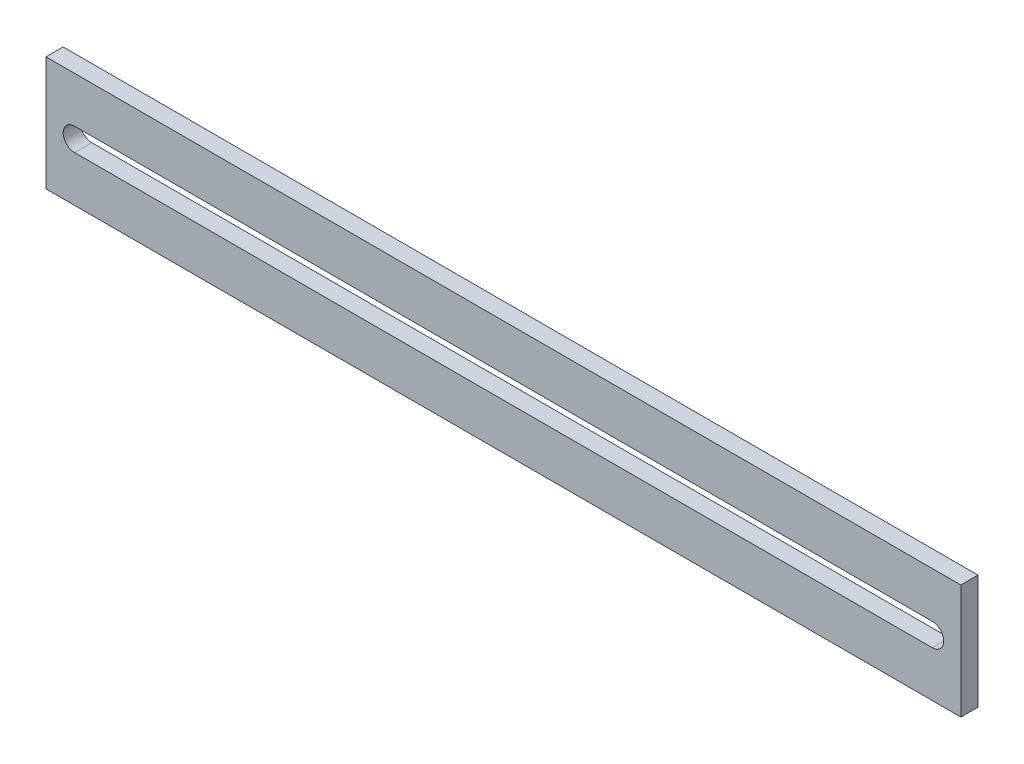
ISO-10303-21;
HEADER;
FILE_DESCRIPTION(('STEP AP214'),'2;1');
FILE_NAME('part.step','',(''),(''),'','','');
FILE_SCHEMA(('AUTOMOTIVE_DESIGN { 1 0 10303 214 1 1 1 1 }'));
ENDSEC;
DATA;
#1=APPLICATION_CONTEXT('core data for automotive mechanical design processes');
#2=APPLICATION_PROTOCOL_DEFINITION('international standard','automotive_design',2000,#1);
#3=PRODUCT_CONTEXT('',#1,'mechanical');
#4=PRODUCT('Part','Part','',(#3));
#5=PRODUCT_RELATED_PRODUCT_CATEGORY('part','',(#4));
#6=PRODUCT_DEFINITION_FORMATION('','',#4);
#7=PRODUCT_DEFINITION_CONTEXT('part definition',#1,'design');
#8=PRODUCT_DEFINITION('design','',#6,#7);
#9=PRODUCT_DEFINITION_SHAPE('','',#8);
#10=(LENGTH_UNIT() NAMED_UNIT(*) SI_UNIT(.MILLI.,.METRE.));
#11=(NAMED_UNIT(*) PLANE_ANGLE_UNIT() SI_UNIT($,.RADIAN.));
#12=(NAMED_UNIT(*) SI_UNIT($,.STERADIAN.) SOLID_ANGLE_UNIT());
#13=UNCERTAINTY_MEASURE_WITH_UNIT(LENGTH_MEASURE(1.E-05),#10,'distance_accuracy_value','');
#14=(GEOMETRIC_REPRESENTATION_CONTEXT(3) GLOBAL_UNCERTAINTY_ASSIGNED_CONTEXT((#13)) GLOBAL_UNIT_ASSIGNED_CONTEXT((#10,
#11,#12)) REPRESENTATION_CONTEXT('',''));
#15=CARTESIAN_POINT('',(0.,0.,0.));
#16=DIRECTION('',(0.,0.,1.));
#17=DIRECTION('',(1.,0.,0.));
#18=AXIS2_PLACEMENT_3D('',#15,#16,#17);
#19=CARTESIAN_POINT('',(80.,10.,3.));
#20=DIRECTION('',(-1.,0.,0.));
#21=DIRECTION('',(0.,0.,1.));
#22=AXIS2_PLACEMENT_3D('',#19,#20,#21);
#23=PLANE('',#22);
#24=DIRECTION('',(0.,1.,0.));
#25=VECTOR('',#24,1.);
#26=CARTESIAN_POINT('',(80.,10.,0.));
#27=LINE('',#26,#25);
#28=CARTESIAN_POINT('',(80.,-10.,0.));
#29=VERTEX_POINT('',#28);
#30=CARTESIAN_POINT('',(80.,10.,0.));
#31=VERTEX_POINT('',#30);
#32=EDGE_CURVE('E131',#29,#31,#27,.T.);
#33=ORIENTED_EDGE('',*,*,#32,.T.);
#34=DIRECTION('',(0.,0.,-1.));
#35=VECTOR('',#34,1.);
#36=CARTESIAN_POINT('',(80.,10.,3.));
#37=LINE('',#36,#35);
#38=CARTESIAN_POINT('',(80.,10.,3.));
#39=VERTEX_POINT('',#38);
#40=EDGE_CURVE('E11',#39,#31,#37,.T.);
#41=ORIENTED_EDGE('',*,*,#40,.F.);
#42=DIRECTION('',(0.,1.,0.));
#43=VECTOR('',#42,1.);
#44=CARTESIAN_POINT('',(80.,10.,3.));
#45=LINE('',#44,#43);
#46=CARTESIAN_POINT('',(80.,-10.,3.));
#47=VERTEX_POINT('',#46);
#48=EDGE_CURVE('E135',#47,#39,#45,.T.);
#49=ORIENTED_EDGE('',*,*,#48,.F.);
#50=DIRECTION('',(0.,0.,-1.));
#51=VECTOR('',#50,1.);
#52=CARTESIAN_POINT('',(80.,-10.,3.));
#53=LINE('',#52,#51);
#54=EDGE_CURVE('E145',#47,#29,#53,.T.);
#55=ORIENTED_EDGE('',*,*,#54,.T.);
#56=EDGE_LOOP('',(#33,#41,#49,#55));
#57=FACE_BOUND('',#56,.T.);
#58=ADVANCED_FACE('F34',(#57),#23,.F.);
#59=CARTESIAN_POINT('',(-80.,10.,3.));
#60=DIRECTION('',(0.,-1.,0.));
#61=DIRECTION('',(0.,0.,-1.));
#62=AXIS2_PLACEMENT_3D('',#59,#60,#61);
#63=PLANE('',#62);
#64=DIRECTION('',(-1.,0.,0.));
#65=VECTOR('',#64,1.);
#66=CARTESIAN_POINT('',(-80.,10.,0.));
#67=LINE('',#66,#65);
#68=CARTESIAN_POINT('',(-80.,10.,0.));
#69=VERTEX_POINT('',#68);
#70=EDGE_CURVE('E148',#31,#69,#67,.T.);
#71=ORIENTED_EDGE('',*,*,#70,.T.);
#72=DIRECTION('',(0.,0.,-1.));
#73=VECTOR('',#72,1.);
#74=CARTESIAN_POINT('',(-80.,10.,3.));
#75=LINE('',#74,#73);
#76=CARTESIAN_POINT('',(-80.,10.,3.));
#77=VERTEX_POINT('',#76);
#78=EDGE_CURVE('E41',#77,#69,#75,.T.);
#79=ORIENTED_EDGE('',*,*,#78,.F.);
#80=DIRECTION('',(-1.,0.,0.));
#81=VECTOR('',#80,1.);
#82=CARTESIAN_POINT('',(-80.,10.,3.));
#83=LINE('',#82,#81);
#84=EDGE_CURVE('E138',#39,#77,#83,.T.);
#85=ORIENTED_EDGE('',*,*,#84,.F.);
#86=ORIENTED_EDGE('',*,*,#40,.T.);
#87=EDGE_LOOP('',(#71,#79,#85,#86));
#88=FACE_BOUND('',#87,.T.);
#89=ADVANCED_FACE('F176',(#88),#63,.F.);
#90=CARTESIAN_POINT('',(-80.,10.,3.));
#91=DIRECTION('',(1.,0.,0.));
#92=DIRECTION('',(0.,0.,-1.));
#93=AXIS2_PLACEMENT_3D('',#90,#91,#92);
#94=PLANE('',#93);
#95=DIRECTION('',(0.,-1.,0.));
#96=VECTOR('',#95,1.);
#97=CARTESIAN_POINT('',(-80.,10.,0.));
#98=LINE('',#97,#96);
#99=CARTESIAN_POINT('',(-80.,-10.,0.));
#100=VERTEX_POINT('',#99);
#101=EDGE_CURVE('E150',#69,#100,#98,.T.);
#102=ORIENTED_EDGE('',*,*,#101,.T.);
#103=DIRECTION('',(0.,0.,-1.));
#104=VECTOR('',#103,1.);
#105=CARTESIAN_POINT('',(-80.,-10.,3.));
#106=LINE('',#105,#104);
#107=CARTESIAN_POINT('',(-80.,-10.,3.));
#108=VERTEX_POINT('',#107);
#109=EDGE_CURVE('E155',#108,#100,#106,.T.);
#110=ORIENTED_EDGE('',*,*,#109,.F.);
#111=DIRECTION('',(0.,-1.,0.));
#112=VECTOR('',#111,1.);
#113=CARTESIAN_POINT('',(-80.,10.,3.));
#114=LINE('',#113,#112);
#115=EDGE_CURVE('E141',#77,#108,#114,.T.);
#116=ORIENTED_EDGE('',*,*,#115,.F.);
#117=ORIENTED_EDGE('',*,*,#78,.T.);
#118=EDGE_LOOP('',(#102,#110,#116,#117));
#119=FACE_BOUND('',#118,.T.);
#120=ADVANCED_FACE('F162',(#119),#94,.F.);
#121=CARTESIAN_POINT('',(-80.,-10.,3.));
#122=DIRECTION('',(0.,1.,0.));
#123=DIRECTION('',(0.,0.,1.));
#124=AXIS2_PLACEMENT_3D('',#121,#122,#123);
#125=PLANE('',#124);
#126=DIRECTION('',(1.,0.,0.));
#127=VECTOR('',#126,1.);
#128=CARTESIAN_POINT('',(-80.,-10.,0.));
#129=LINE('',#128,#127);
#130=EDGE_CURVE('E139',#100,#29,#129,.T.);
#131=ORIENTED_EDGE('',*,*,#130,.T.);
#132=ORIENTED_EDGE('',*,*,#54,.F.);
#133=DIRECTION('',(1.,0.,0.));
#134=VECTOR('',#133,1.);
#135=CARTESIAN_POINT('',(-80.,-10.,3.));
#136=LINE('',#135,#134);
#137=EDGE_CURVE('E143',#108,#47,#136,.T.);
#138=ORIENTED_EDGE('',*,*,#137,.F.);
#139=ORIENTED_EDGE('',*,*,#109,.T.);
#140=EDGE_LOOP('',(#131,#132,#138,#139));
#141=FACE_BOUND('',#140,.T.);
#142=ADVANCED_FACE('F169',(#141),#125,.F.);
#143=CARTESIAN_POINT('',(0.,0.,3.));
#144=DIRECTION('',(0.,0.,1.));
#145=DIRECTION('',(1.,0.,0.));
#146=AXIS2_PLACEMENT_3D('',#143,#144,#145);
#147=PLANE('',#146);
#148=CARTESIAN_POINT('',(-75.,0.,3.));
#149=DIRECTION('',(0.,0.,1.));
#150=DIRECTION('',(1.,0.,0.));
#151=AXIS2_PLACEMENT_3D('',#148,#149,#150);
#152=CIRCLE('',#151,2.);
#153=CARTESIAN_POINT('',(-75.,2.,3.));
#154=VERTEX_POINT('',#153);
#155=CARTESIAN_POINT('',(-75.,-2.,3.));
#156=VERTEX_POINT('',#155);
#157=EDGE_CURVE('E48',#154,#156,#152,.T.);
#158=ORIENTED_EDGE('',*,*,#157,.F.);
#159=DIRECTION('',(-1.,0.,0.));
#160=VECTOR('',#159,1.);
#161=CARTESIAN_POINT('',(-75.,2.,3.));
#162=LINE('',#161,#160);
#163=CARTESIAN_POINT('',(75.,2.,3.));
#164=VERTEX_POINT('',#163);
#165=EDGE_CURVE('E116',#164,#154,#162,.T.);
#166=ORIENTED_EDGE('',*,*,#165,.F.);
#167=CARTESIAN_POINT('',(75.,0.,3.));
#168=DIRECTION('',(0.,0.,1.));
#169=DIRECTION('',(1.,0.,0.));
#170=AXIS2_PLACEMENT_3D('',#167,#168,#169);
#171=CIRCLE('',#170,2.);
#172=CARTESIAN_POINT('',(75.,-2.,3.));
#173=VERTEX_POINT('',#172);
#174=EDGE_CURVE('E119',#173,#164,#171,.T.);
#175=ORIENTED_EDGE('',*,*,#174,.F.);
#176=DIRECTION('',(1.,0.,0.));
#177=VECTOR('',#176,1.);
#178=CARTESIAN_POINT('',(-75.,-2.,3.));
#179=LINE('',#178,#177);
#180=EDGE_CURVE('E125',#156,#173,#179,.T.);
#181=ORIENTED_EDGE('',*,*,#180,.F.);
#182=EDGE_LOOP('',(#158,#166,#175,#181));
#183=FACE_BOUND('',#182,.T.);
#184=ORIENTED_EDGE('',*,*,#48,.T.);
#185=ORIENTED_EDGE('',*,*,#84,.T.);
#186=ORIENTED_EDGE('',*,*,#115,.T.);
#187=ORIENTED_EDGE('',*,*,#137,.T.);
#188=EDGE_LOOP('',(#184,#185,#186,#187));
#189=FACE_BOUND('',#188,.T.);
#190=ADVANCED_FACE('F175',(#183,#189),#147,.T.);
#191=CARTESIAN_POINT('',(0.,0.,0.));
#192=DIRECTION('',(0.,0.,1.));
#193=DIRECTION('',(1.,0.,0.));
#194=AXIS2_PLACEMENT_3D('',#191,#192,#193);
#195=PLANE('',#194);
#196=DIRECTION('',(-1.,0.,0.));
#197=VECTOR('',#196,1.);
#198=CARTESIAN_POINT('',(-75.,2.,0.));
#199=LINE('',#198,#197);
#200=CARTESIAN_POINT('',(75.,2.,0.));
#201=VERTEX_POINT('',#200);
#202=CARTESIAN_POINT('',(-75.,2.,0.));
#203=VERTEX_POINT('',#202);
#204=EDGE_CURVE('E106',#201,#203,#199,.T.);
#205=ORIENTED_EDGE('',*,*,#204,.T.);
#206=CARTESIAN_POINT('',(-75.,0.,0.));
#207=DIRECTION('',(0.,0.,1.));
#208=DIRECTION('',(1.,0.,0.));
#209=AXIS2_PLACEMENT_3D('',#206,#207,#208);
#210=CIRCLE('',#209,2.);
#211=CARTESIAN_POINT('',(-75.,-2.,0.));
#212=VERTEX_POINT('',#211);
#213=EDGE_CURVE('E100',#203,#212,#210,.T.);
#214=ORIENTED_EDGE('',*,*,#213,.T.);
#215=DIRECTION('',(1.,0.,0.));
#216=VECTOR('',#215,1.);
#217=CARTESIAN_POINT('',(-75.,-2.,0.));
#218=LINE('',#217,#216);
#219=CARTESIAN_POINT('',(75.,-2.,0.));
#220=VERTEX_POINT('',#219);
#221=EDGE_CURVE('E109',#212,#220,#218,.T.);
#222=ORIENTED_EDGE('',*,*,#221,.T.);
#223=CARTESIAN_POINT('',(75.,0.,0.));
#224=DIRECTION('',(0.,0.,1.));
#225=DIRECTION('',(1.,0.,0.));
#226=AXIS2_PLACEMENT_3D('',#223,#224,#225);
#227=CIRCLE('',#226,2.);
#228=EDGE_CURVE('E56',#220,#201,#227,.T.);
#229=ORIENTED_EDGE('',*,*,#228,.T.);
#230=EDGE_LOOP('',(#205,#214,#222,#229));
#231=FACE_BOUND('',#230,.T.);
#232=ORIENTED_EDGE('',*,*,#32,.F.);
#233=ORIENTED_EDGE('',*,*,#130,.F.);
#234=ORIENTED_EDGE('',*,*,#101,.F.);
#235=ORIENTED_EDGE('',*,*,#70,.F.);
#236=EDGE_LOOP('',(#232,#233,#234,#235));
#237=FACE_BOUND('',#236,.T.);
#238=ADVANCED_FACE('F113',(#231,#237),#195,.F.);
#239=CARTESIAN_POINT('',(-75.,0.,0.));
#240=DIRECTION('',(0.,0.,1.));
#241=DIRECTION('',(1.,0.,0.));
#242=AXIS2_PLACEMENT_3D('',#239,#240,#241);
#243=CYLINDRICAL_SURFACE('',#242,2.);
#244=ORIENTED_EDGE('',*,*,#157,.T.);
#245=DIRECTION('',(0.,0.,1.));
#246=VECTOR('',#245,1.);
#247=CARTESIAN_POINT('',(-75.,-2.,0.));
#248=LINE('',#247,#246);
#249=EDGE_CURVE('E96',#212,#156,#248,.T.);
#250=ORIENTED_EDGE('',*,*,#249,.F.);
#251=ORIENTED_EDGE('',*,*,#213,.F.);
#252=DIRECTION('',(0.,0.,1.));
#253=VECTOR('',#252,1.);
#254=CARTESIAN_POINT('',(-75.,2.,0.));
#255=LINE('',#254,#253);
#256=EDGE_CURVE('E129',#203,#154,#255,.T.);
#257=ORIENTED_EDGE('',*,*,#256,.T.);
#258=EDGE_LOOP('',(#244,#250,#251,#257));
#259=FACE_BOUND('',#258,.T.);
#260=ADVANCED_FACE('F98',(#259),#243,.F.);
#261=CARTESIAN_POINT('',(-75.,2.,0.));
#262=DIRECTION('',(0.,1.,0.));
#263=DIRECTION('',(0.,0.,1.));
#264=AXIS2_PLACEMENT_3D('',#261,#262,#263);
#265=PLANE('',#264);
#266=ORIENTED_EDGE('',*,*,#165,.T.);
#267=ORIENTED_EDGE('',*,*,#256,.F.);
#268=ORIENTED_EDGE('',*,*,#204,.F.);
#269=DIRECTION('',(0.,0.,1.));
#270=VECTOR('',#269,1.);
#271=CARTESIAN_POINT('',(75.,2.,0.));
#272=LINE('',#271,#270);
#273=EDGE_CURVE('E132',#201,#164,#272,.T.);
#274=ORIENTED_EDGE('',*,*,#273,.T.);
#275=EDGE_LOOP('',(#266,#267,#268,#274));
#276=FACE_BOUND('',#275,.T.);
#277=ADVANCED_FACE('F193',(#276),#265,.F.);
#278=CARTESIAN_POINT('',(75.,0.,0.));
#279=DIRECTION('',(0.,0.,1.));
#280=DIRECTION('',(1.,0.,0.));
#281=AXIS2_PLACEMENT_3D('',#278,#279,#280);
#282=CYLINDRICAL_SURFACE('',#281,2.);
#283=ORIENTED_EDGE('',*,*,#174,.T.);
#284=ORIENTED_EDGE('',*,*,#273,.F.);
#285=ORIENTED_EDGE('',*,*,#228,.F.);
#286=DIRECTION('',(0.,0.,1.));
#287=VECTOR('',#286,1.);
#288=CARTESIAN_POINT('',(75.,-2.,0.));
#289=LINE('',#288,#287);
#290=EDGE_CURVE('E105',#220,#173,#289,.T.);
#291=ORIENTED_EDGE('',*,*,#290,.T.);
#292=EDGE_LOOP('',(#283,#284,#285,#291));
#293=FACE_BOUND('',#292,.T.);
#294=ADVANCED_FACE('F196',(#293),#282,.F.);
#295=CARTESIAN_POINT('',(-75.,-2.,0.));
#296=DIRECTION('',(0.,-1.,0.));
#297=DIRECTION('',(0.,0.,-1.));
#298=AXIS2_PLACEMENT_3D('',#295,#296,#297);
#299=PLANE('',#298);
#300=ORIENTED_EDGE('',*,*,#180,.T.);
#301=ORIENTED_EDGE('',*,*,#290,.F.);
#302=ORIENTED_EDGE('',*,*,#221,.F.);
#303=ORIENTED_EDGE('',*,*,#249,.T.);
#304=EDGE_LOOP('',(#300,#301,#302,#303));
#305=FACE_BOUND('',#304,.T.);
#306=ADVANCED_FACE('F110',(#305),#299,.F.);
#307=CLOSED_SHELL('',(#58,#89,#120,#142,#190,#238,#260,#277,#294,#306));
#308=MANIFOLD_SOLID_BREP('B2',#307);
#309=ADVANCED_BREP_SHAPE_REPRESENTATION('',(#18,#308),#14);
#310=SHAPE_DEFINITION_REPRESENTATION(#9,#309);
ENDSEC;
END-ISO-10303-21;
